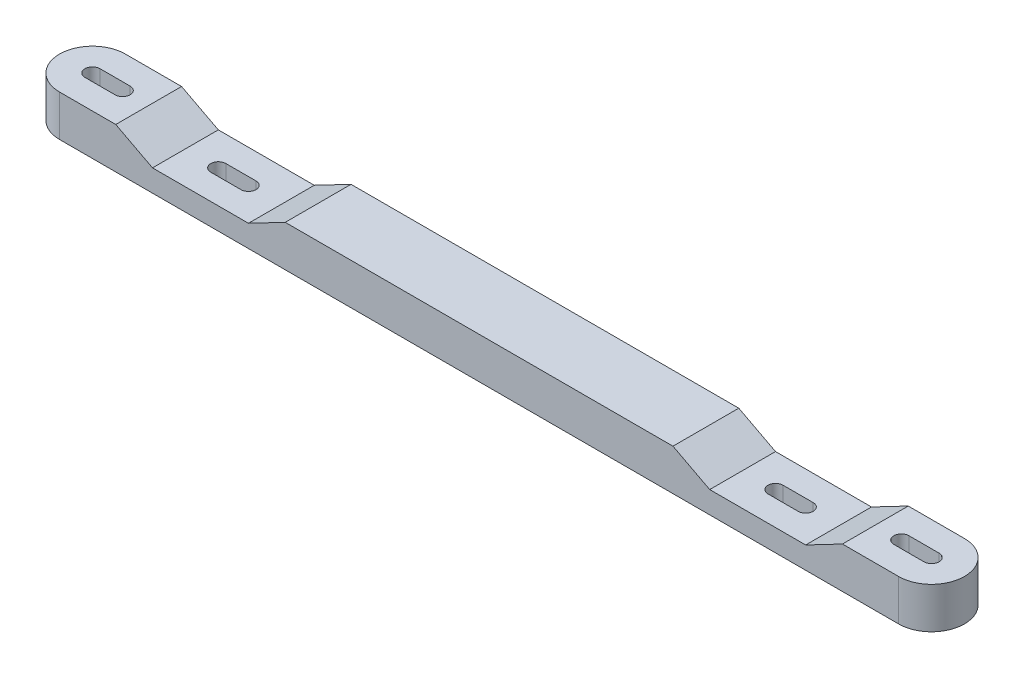
ISO-10303-21;
HEADER;
FILE_DESCRIPTION(('STEP AP214'),'2;1');
FILE_NAME('part.step','',(''),(''),'','','');
FILE_SCHEMA(('AUTOMOTIVE_DESIGN { 1 0 10303 214 1 1 1 1 }'));
ENDSEC;
DATA;
#1=APPLICATION_CONTEXT('core data for automotive mechanical design processes');
#2=APPLICATION_PROTOCOL_DEFINITION('international standard','automotive_design',2000,#1);
#3=PRODUCT_CONTEXT('',#1,'mechanical');
#4=PRODUCT('Part','Part','',(#3));
#5=PRODUCT_RELATED_PRODUCT_CATEGORY('part','',(#4));
#6=PRODUCT_DEFINITION_FORMATION('','',#4);
#7=PRODUCT_DEFINITION_CONTEXT('part definition',#1,'design');
#8=PRODUCT_DEFINITION('design','',#6,#7);
#9=PRODUCT_DEFINITION_SHAPE('','',#8);
#10=(LENGTH_UNIT() NAMED_UNIT(*) SI_UNIT(.MILLI.,.METRE.));
#11=(NAMED_UNIT(*) PLANE_ANGLE_UNIT() SI_UNIT($,.RADIAN.));
#12=(NAMED_UNIT(*) SI_UNIT($,.STERADIAN.) SOLID_ANGLE_UNIT());
#13=UNCERTAINTY_MEASURE_WITH_UNIT(LENGTH_MEASURE(1.E-05),#10,'distance_accuracy_value','');
#14=(GEOMETRIC_REPRESENTATION_CONTEXT(3) GLOBAL_UNCERTAINTY_ASSIGNED_CONTEXT((#13)) GLOBAL_UNIT_ASSIGNED_CONTEXT((#10,
#11,#12)) REPRESENTATION_CONTEXT('',''));
#15=CARTESIAN_POINT('',(0.,0.,0.));
#16=DIRECTION('',(0.,0.,1.));
#17=DIRECTION('',(1.,0.,0.));
#18=AXIS2_PLACEMENT_3D('',#15,#16,#17);
#19=CARTESIAN_POINT('',(-153.,15.,-101.6));
#20=DIRECTION('',(0.,1.,0.));
#21=DIRECTION('',(0.,0.,1.));
#22=AXIS2_PLACEMENT_3D('',#19,#20,#21);
#23=PLANE('',#22);
#24=DIRECTION('',(0.,0.,1.));
#25=VECTOR('',#24,1.);
#26=CARTESIAN_POINT('',(70.6999999999999,15.,-113.6));
#27=LINE('',#26,#25);
#28=CARTESIAN_POINT('',(70.6999999999999,15.,-113.6));
#29=VERTEX_POINT('',#28);
#30=CARTESIAN_POINT('',(70.6999999999999,15.,-89.6));
#31=VERTEX_POINT('',#30);
#32=EDGE_CURVE('E262',#29,#31,#27,.T.);
#33=ORIENTED_EDGE('',*,*,#32,.F.);
#34=DIRECTION('',(-1.,0.,0.));
#35=VECTOR('',#34,1.);
#36=CARTESIAN_POINT('',(-153.,15.,-113.6));
#37=LINE('',#36,#35);
#38=CARTESIAN_POINT('',(-70.7,15.,-113.6));
#39=VERTEX_POINT('',#38);
#40=EDGE_CURVE('E247',#29,#39,#37,.T.);
#41=ORIENTED_EDGE('',*,*,#40,.T.);
#42=DIRECTION('',(0.,0.,1.));
#43=VECTOR('',#42,1.);
#44=CARTESIAN_POINT('',(-70.7,15.,-113.6));
#45=LINE('',#44,#43);
#46=CARTESIAN_POINT('',(-70.7,15.,-89.6));
#47=VERTEX_POINT('',#46);
#48=EDGE_CURVE('E282',#39,#47,#45,.T.);
#49=ORIENTED_EDGE('',*,*,#48,.T.);
#50=DIRECTION('',(1.,0.,0.));
#51=VECTOR('',#50,1.);
#52=CARTESIAN_POINT('',(-153.,15.,-89.6));
#53=LINE('',#52,#51);
#54=EDGE_CURVE('E475',#47,#31,#53,.T.);
#55=ORIENTED_EDGE('',*,*,#54,.T.);
#56=EDGE_LOOP('',(#33,#41,#49,#55));
#57=FACE_BOUND('',#56,.T.);
#58=ADVANCED_FACE('F39',(#57),#23,.T.);
#59=DIRECTION('',(0.,0.,1.));
#60=VECTOR('',#59,1.);
#61=CARTESIAN_POINT('',(132.5,15.,-113.6));
#62=LINE('',#61,#60);
#63=CARTESIAN_POINT('',(132.5,15.,-113.6));
#64=VERTEX_POINT('',#63);
#65=CARTESIAN_POINT('',(132.5,15.,-89.6));
#66=VERTEX_POINT('',#65);
#67=EDGE_CURVE('E266',#64,#66,#62,.T.);
#68=ORIENTED_EDGE('',*,*,#67,.T.);
#69=CARTESIAN_POINT('',(153.,15.,-89.6));
#70=VERTEX_POINT('',#69);
#71=EDGE_CURVE('E468',#66,#70,#53,.T.);
#72=ORIENTED_EDGE('',*,*,#71,.T.);
#73=CARTESIAN_POINT('',(153.,15.,-101.6));
#74=DIRECTION('',(0.,1.,0.));
#75=DIRECTION('',(0.,0.,1.));
#76=AXIS2_PLACEMENT_3D('',#73,#74,#75);
#77=CIRCLE('',#76,12.);
#78=CARTESIAN_POINT('',(153.,15.,-113.6));
#79=VERTEX_POINT('',#78);
#80=EDGE_CURVE('E474',#70,#79,#77,.T.);
#81=ORIENTED_EDGE('',*,*,#80,.T.);
#82=EDGE_CURVE('E479',#79,#64,#37,.T.);
#83=ORIENTED_EDGE('',*,*,#82,.T.);
#84=EDGE_LOOP('',(#68,#72,#81,#83));
#85=FACE_BOUND('',#84,.T.);
#86=DIRECTION('',(-1.,0.,0.));
#87=VECTOR('',#86,1.);
#88=CARTESIAN_POINT('',(153.,15.,-104.35));
#89=LINE('',#88,#87);
#90=CARTESIAN_POINT('',(153.,15.,-104.35));
#91=VERTEX_POINT('',#90);
#92=CARTESIAN_POINT('',(142.,15.,-104.35));
#93=VERTEX_POINT('',#92);
#94=EDGE_CURVE('E325',#91,#93,#89,.T.);
#95=ORIENTED_EDGE('',*,*,#94,.F.);
#96=CARTESIAN_POINT('',(153.,15.,-101.6));
#97=DIRECTION('',(0.,1.,0.));
#98=DIRECTION('',(0.,0.,1.));
#99=AXIS2_PLACEMENT_3D('',#96,#97,#98);
#100=CIRCLE('',#99,2.75);
#101=CARTESIAN_POINT('',(153.,15.,-98.85));
#102=VERTEX_POINT('',#101);
#103=EDGE_CURVE('E322',#102,#91,#100,.T.);
#104=ORIENTED_EDGE('',*,*,#103,.F.);
#105=DIRECTION('',(1.,0.,0.));
#106=VECTOR('',#105,1.);
#107=CARTESIAN_POINT('',(153.,15.,-98.85));
#108=LINE('',#107,#106);
#109=CARTESIAN_POINT('',(142.,15.,-98.85));
#110=VERTEX_POINT('',#109);
#111=EDGE_CURVE('E333',#110,#102,#108,.T.);
#112=ORIENTED_EDGE('',*,*,#111,.F.);
#113=CARTESIAN_POINT('',(142.,15.,-101.6));
#114=DIRECTION('',(0.,1.,0.));
#115=DIRECTION('',(0.,0.,1.));
#116=AXIS2_PLACEMENT_3D('',#113,#114,#115);
#117=CIRCLE('',#116,2.75);
#118=EDGE_CURVE('E329',#93,#110,#117,.T.);
#119=ORIENTED_EDGE('',*,*,#118,.F.);
#120=EDGE_LOOP('',(#95,#104,#112,#119));
#121=FACE_BOUND('',#120,.T.);
#122=ADVANCED_FACE('F546',(#85,#121),#23,.T.);
#123=DIRECTION('',(0.,0.,1.));
#124=VECTOR('',#123,1.);
#125=CARTESIAN_POINT('',(-132.5,15.,-113.6));
#126=LINE('',#125,#124);
#127=CARTESIAN_POINT('',(-132.5,15.,-113.6));
#128=VERTEX_POINT('',#127);
#129=CARTESIAN_POINT('',(-132.5,15.,-89.6));
#130=VERTEX_POINT('',#129);
#131=EDGE_CURVE('E298',#128,#130,#126,.T.);
#132=ORIENTED_EDGE('',*,*,#131,.F.);
#133=CARTESIAN_POINT('',(-153.,15.,-113.6));
#134=VERTEX_POINT('',#133);
#135=EDGE_CURVE('E478',#128,#134,#37,.T.);
#136=ORIENTED_EDGE('',*,*,#135,.T.);
#137=CARTESIAN_POINT('',(-153.,15.,-101.6));
#138=DIRECTION('',(0.,1.,0.));
#139=DIRECTION('',(0.,0.,1.));
#140=AXIS2_PLACEMENT_3D('',#137,#138,#139);
#141=CIRCLE('',#140,12.);
#142=CARTESIAN_POINT('',(-153.,15.,-89.6));
#143=VERTEX_POINT('',#142);
#144=EDGE_CURVE('E464',#134,#143,#141,.T.);
#145=ORIENTED_EDGE('',*,*,#144,.T.);
#146=EDGE_CURVE('E470',#143,#130,#53,.T.);
#147=ORIENTED_EDGE('',*,*,#146,.T.);
#148=EDGE_LOOP('',(#132,#136,#145,#147));
#149=FACE_BOUND('',#148,.T.);
#150=DIRECTION('',(1.,0.,0.));
#151=VECTOR('',#150,1.);
#152=CARTESIAN_POINT('',(-153.,15.,-98.85));
#153=LINE('',#152,#151);
#154=CARTESIAN_POINT('',(-153.,15.,-98.85));
#155=VERTEX_POINT('',#154);
#156=CARTESIAN_POINT('',(-142.,15.,-98.85));
#157=VERTEX_POINT('',#156);
#158=EDGE_CURVE('E424',#155,#157,#153,.T.);
#159=ORIENTED_EDGE('',*,*,#158,.F.);
#160=CARTESIAN_POINT('',(-153.,15.,-101.6));
#161=DIRECTION('',(0.,1.,0.));
#162=DIRECTION('',(0.,0.,1.));
#163=AXIS2_PLACEMENT_3D('',#160,#161,#162);
#164=CIRCLE('',#163,2.75);
#165=CARTESIAN_POINT('',(-153.,15.,-104.35));
#166=VERTEX_POINT('',#165);
#167=EDGE_CURVE('E421',#166,#155,#164,.T.);
#168=ORIENTED_EDGE('',*,*,#167,.F.);
#169=DIRECTION('',(-1.,0.,0.));
#170=VECTOR('',#169,1.);
#171=CARTESIAN_POINT('',(-153.,15.,-104.35));
#172=LINE('',#171,#170);
#173=CARTESIAN_POINT('',(-142.,15.,-104.35));
#174=VERTEX_POINT('',#173);
#175=EDGE_CURVE('E432',#174,#166,#172,.T.);
#176=ORIENTED_EDGE('',*,*,#175,.F.);
#177=CARTESIAN_POINT('',(-142.,15.,-101.6));
#178=DIRECTION('',(0.,1.,0.));
#179=DIRECTION('',(0.,0.,1.));
#180=AXIS2_PLACEMENT_3D('',#177,#178,#179);
#181=CIRCLE('',#180,2.75);
#182=EDGE_CURVE('E428',#157,#174,#181,.T.);
#183=ORIENTED_EDGE('',*,*,#182,.F.);
#184=EDGE_LOOP('',(#159,#168,#176,#183));
#185=FACE_BOUND('',#184,.T.);
#186=ADVANCED_FACE('F549',(#149,#185),#23,.T.);
#187=CARTESIAN_POINT('',(-153.,0.,-101.6));
#188=DIRECTION('',(0.,1.,0.));
#189=DIRECTION('',(0.,0.,1.));
#190=AXIS2_PLACEMENT_3D('',#187,#188,#189);
#191=PLANE('',#190);
#192=CARTESIAN_POINT('',(96.1,0.,-101.6));
#193=DIRECTION('',(0.,1.,0.));
#194=DIRECTION('',(0.,0.,1.));
#195=AXIS2_PLACEMENT_3D('',#192,#193,#194);
#196=CIRCLE('',#195,2.75);
#197=CARTESIAN_POINT('',(96.1,0.,-104.35));
#198=VERTEX_POINT('',#197);
#199=CARTESIAN_POINT('',(96.1,0.,-98.85));
#200=VERTEX_POINT('',#199);
#201=EDGE_CURVE('E364',#198,#200,#196,.T.);
#202=ORIENTED_EDGE('',*,*,#201,.T.);
#203=DIRECTION('',(1.,0.,0.));
#204=VECTOR('',#203,1.);
#205=CARTESIAN_POINT('',(96.1,0.,-98.85));
#206=LINE('',#205,#204);
#207=CARTESIAN_POINT('',(107.1,0.,-98.85));
#208=VERTEX_POINT('',#207);
#209=EDGE_CURVE('E368',#200,#208,#206,.T.);
#210=ORIENTED_EDGE('',*,*,#209,.T.);
#211=CARTESIAN_POINT('',(107.1,0.,-101.6));
#212=DIRECTION('',(0.,1.,0.));
#213=DIRECTION('',(0.,0.,1.));
#214=AXIS2_PLACEMENT_3D('',#211,#212,#213);
#215=CIRCLE('',#214,2.75);
#216=CARTESIAN_POINT('',(107.1,0.,-104.35));
#217=VERTEX_POINT('',#216);
#218=EDGE_CURVE('E372',#208,#217,#215,.T.);
#219=ORIENTED_EDGE('',*,*,#218,.T.);
#220=DIRECTION('',(-1.,0.,0.));
#221=VECTOR('',#220,1.);
#222=CARTESIAN_POINT('',(96.1,0.,-104.35));
#223=LINE('',#222,#221);
#224=EDGE_CURVE('E376',#217,#198,#223,.T.);
#225=ORIENTED_EDGE('',*,*,#224,.T.);
#226=EDGE_LOOP('',(#202,#210,#219,#225));
#227=FACE_BOUND('',#226,.T.);
#228=CARTESIAN_POINT('',(-153.,0.,-101.6));
#229=DIRECTION('',(0.,1.,0.));
#230=DIRECTION('',(0.,0.,1.));
#231=AXIS2_PLACEMENT_3D('',#228,#229,#230);
#232=CIRCLE('',#231,2.75);
#233=CARTESIAN_POINT('',(-153.,0.,-104.35));
#234=VERTEX_POINT('',#233);
#235=CARTESIAN_POINT('',(-153.,0.,-98.85));
#236=VERTEX_POINT('',#235);
#237=EDGE_CURVE('E420',#234,#236,#232,.T.);
#238=ORIENTED_EDGE('',*,*,#237,.T.);
#239=DIRECTION('',(1.,0.,0.));
#240=VECTOR('',#239,1.);
#241=CARTESIAN_POINT('',(-153.,0.,-98.85));
#242=LINE('',#241,#240);
#243=CARTESIAN_POINT('',(-142.,0.,-98.85));
#244=VERTEX_POINT('',#243);
#245=EDGE_CURVE('E439',#236,#244,#242,.T.);
#246=ORIENTED_EDGE('',*,*,#245,.T.);
#247=CARTESIAN_POINT('',(-142.,0.,-101.6));
#248=DIRECTION('',(0.,1.,0.));
#249=DIRECTION('',(0.,0.,1.));
#250=AXIS2_PLACEMENT_3D('',#247,#248,#249);
#251=CIRCLE('',#250,2.75);
#252=CARTESIAN_POINT('',(-142.,0.,-104.35));
#253=VERTEX_POINT('',#252);
#254=EDGE_CURVE('E443',#244,#253,#251,.T.);
#255=ORIENTED_EDGE('',*,*,#254,.T.);
#256=DIRECTION('',(-1.,0.,0.));
#257=VECTOR('',#256,1.);
#258=CARTESIAN_POINT('',(-153.,0.,-104.35));
#259=LINE('',#258,#257);
#260=EDGE_CURVE('E425',#253,#234,#259,.T.);
#261=ORIENTED_EDGE('',*,*,#260,.T.);
#262=EDGE_LOOP('',(#238,#246,#255,#261));
#263=FACE_BOUND('',#262,.T.);
#264=CARTESIAN_POINT('',(-153.,0.,-101.6));
#265=DIRECTION('',(0.,1.,0.));
#266=DIRECTION('',(0.,0.,1.));
#267=AXIS2_PLACEMENT_3D('',#264,#265,#266);
#268=CIRCLE('',#267,12.);
#269=CARTESIAN_POINT('',(-153.,0.,-113.6));
#270=VERTEX_POINT('',#269);
#271=CARTESIAN_POINT('',(-153.,0.,-89.6));
#272=VERTEX_POINT('',#271);
#273=EDGE_CURVE('E463',#270,#272,#268,.T.);
#274=ORIENTED_EDGE('',*,*,#273,.F.);
#275=DIRECTION('',(-1.,0.,0.));
#276=VECTOR('',#275,1.);
#277=CARTESIAN_POINT('',(-153.,0.,-113.6));
#278=LINE('',#277,#276);
#279=CARTESIAN_POINT('',(153.,0.,-113.6));
#280=VERTEX_POINT('',#279);
#281=EDGE_CURVE('E469',#280,#270,#278,.T.);
#282=ORIENTED_EDGE('',*,*,#281,.F.);
#283=CARTESIAN_POINT('',(153.,0.,-101.6));
#284=DIRECTION('',(0.,1.,0.));
#285=DIRECTION('',(0.,0.,1.));
#286=AXIS2_PLACEMENT_3D('',#283,#284,#285);
#287=CIRCLE('',#286,12.);
#288=CARTESIAN_POINT('',(153.,0.,-89.6));
#289=VERTEX_POINT('',#288);
#290=EDGE_CURVE('E490',#289,#280,#287,.T.);
#291=ORIENTED_EDGE('',*,*,#290,.F.);
#292=DIRECTION('',(1.,0.,0.));
#293=VECTOR('',#292,1.);
#294=CARTESIAN_POINT('',(-153.,0.,-89.6));
#295=LINE('',#294,#293);
#296=EDGE_CURVE('E487',#272,#289,#295,.T.);
#297=ORIENTED_EDGE('',*,*,#296,.F.);
#298=EDGE_LOOP('',(#274,#282,#291,#297));
#299=FACE_BOUND('',#298,.T.);
#300=CARTESIAN_POINT('',(-107.1,0.,-101.6));
#301=DIRECTION('',(0.,1.,0.));
#302=DIRECTION('',(0.,0.,1.));
#303=AXIS2_PLACEMENT_3D('',#300,#301,#302);
#304=CIRCLE('',#303,2.75);
#305=CARTESIAN_POINT('',(-107.1,0.,-104.35));
#306=VERTEX_POINT('',#305);
#307=CARTESIAN_POINT('',(-107.1,0.,-98.85));
#308=VERTEX_POINT('',#307);
#309=EDGE_CURVE('E392',#306,#308,#304,.T.);
#310=ORIENTED_EDGE('',*,*,#309,.T.);
#311=DIRECTION('',(1.,0.,0.));
#312=VECTOR('',#311,1.);
#313=CARTESIAN_POINT('',(-107.1,0.,-98.85));
#314=LINE('',#313,#312);
#315=CARTESIAN_POINT('',(-96.1,0.,-98.85));
#316=VERTEX_POINT('',#315);
#317=EDGE_CURVE('E396',#308,#316,#314,.T.);
#318=ORIENTED_EDGE('',*,*,#317,.T.);
#319=CARTESIAN_POINT('',(-96.1,0.,-101.6));
#320=DIRECTION('',(0.,1.,0.));
#321=DIRECTION('',(0.,0.,1.));
#322=AXIS2_PLACEMENT_3D('',#319,#320,#321);
#323=CIRCLE('',#322,2.75);
#324=CARTESIAN_POINT('',(-96.1,0.,-104.35));
#325=VERTEX_POINT('',#324);
#326=EDGE_CURVE('E400',#316,#325,#323,.T.);
#327=ORIENTED_EDGE('',*,*,#326,.T.);
#328=DIRECTION('',(-1.,0.,0.));
#329=VECTOR('',#328,1.);
#330=CARTESIAN_POINT('',(-107.1,0.,-104.35));
#331=LINE('',#330,#329);
#332=EDGE_CURVE('E404',#325,#306,#331,.T.);
#333=ORIENTED_EDGE('',*,*,#332,.T.);
#334=EDGE_LOOP('',(#310,#318,#327,#333));
#335=FACE_BOUND('',#334,.T.);
#336=CARTESIAN_POINT('',(153.,0.,-101.6));
#337=DIRECTION('',(0.,1.,0.));
#338=DIRECTION('',(0.,0.,1.));
#339=AXIS2_PLACEMENT_3D('',#336,#337,#338);
#340=CIRCLE('',#339,2.75);
#341=CARTESIAN_POINT('',(153.,0.,-98.85));
#342=VERTEX_POINT('',#341);
#343=CARTESIAN_POINT('',(153.,0.,-104.35));
#344=VERTEX_POINT('',#343);
#345=EDGE_CURVE('E321',#342,#344,#340,.T.);
#346=ORIENTED_EDGE('',*,*,#345,.T.);
#347=DIRECTION('',(-1.,0.,0.));
#348=VECTOR('',#347,1.);
#349=CARTESIAN_POINT('',(153.,0.,-104.35));
#350=LINE('',#349,#348);
#351=CARTESIAN_POINT('',(142.,0.,-104.35));
#352=VERTEX_POINT('',#351);
#353=EDGE_CURVE('E340',#344,#352,#350,.T.);
#354=ORIENTED_EDGE('',*,*,#353,.T.);
#355=CARTESIAN_POINT('',(142.,0.,-101.6));
#356=DIRECTION('',(0.,1.,0.));
#357=DIRECTION('',(0.,0.,1.));
#358=AXIS2_PLACEMENT_3D('',#355,#356,#357);
#359=CIRCLE('',#358,2.75);
#360=CARTESIAN_POINT('',(142.,0.,-98.85));
#361=VERTEX_POINT('',#360);
#362=EDGE_CURVE('E344',#352,#361,#359,.T.);
#363=ORIENTED_EDGE('',*,*,#362,.T.);
#364=DIRECTION('',(1.,0.,0.));
#365=VECTOR('',#364,1.);
#366=CARTESIAN_POINT('',(153.,0.,-98.85));
#367=LINE('',#366,#365);
#368=EDGE_CURVE('E326',#361,#342,#367,.T.);
#369=ORIENTED_EDGE('',*,*,#368,.T.);
#370=EDGE_LOOP('',(#346,#354,#363,#369));
#371=FACE_BOUND('',#370,.T.);
#372=ADVANCED_FACE('F526',(#227,#263,#299,#335,#371),#191,.F.);
#373=CARTESIAN_POINT('',(-153.,15.,-101.6));
#374=DIRECTION('',(0.,-1.,0.));
#375=DIRECTION('',(0.,0.,-1.));
#376=AXIS2_PLACEMENT_3D('',#373,#374,#375);
#377=CYLINDRICAL_SURFACE('',#376,12.);
#378=ORIENTED_EDGE('',*,*,#273,.T.);
#379=DIRECTION('',(0.,-1.,0.));
#380=VECTOR('',#379,1.);
#381=CARTESIAN_POINT('',(-153.,15.,-89.6));
#382=LINE('',#381,#380);
#383=EDGE_CURVE('E506',#143,#272,#382,.T.);
#384=ORIENTED_EDGE('',*,*,#383,.F.);
#385=ORIENTED_EDGE('',*,*,#144,.F.);
#386=DIRECTION('',(0.,-1.,0.));
#387=VECTOR('',#386,1.);
#388=CARTESIAN_POINT('',(-153.,15.,-113.6));
#389=LINE('',#388,#387);
#390=EDGE_CURVE('E483',#134,#270,#389,.T.);
#391=ORIENTED_EDGE('',*,*,#390,.T.);
#392=EDGE_LOOP('',(#378,#384,#385,#391));
#393=FACE_BOUND('',#392,.T.);
#394=ADVANCED_FACE('F41',(#393),#377,.T.);
#395=CARTESIAN_POINT('',(-153.,15.,-89.6));
#396=DIRECTION('',(0.,0.,-1.));
#397=DIRECTION('',(-1.,0.,0.));
#398=AXIS2_PLACEMENT_3D('',#395,#396,#397);
#399=PLANE('',#398);
#400=DIRECTION('',(1.,0.,0.));
#401=VECTOR('',#400,1.);
#402=CARTESIAN_POINT('',(84.1,8.,-89.6));
#403=LINE('',#402,#401);
#404=CARTESIAN_POINT('',(84.1,8.,-89.6));
#405=VERTEX_POINT('',#404);
#406=CARTESIAN_POINT('',(119.1,8.,-89.6));
#407=VERTEX_POINT('',#406);
#408=EDGE_CURVE('E252',#405,#407,#403,.T.);
#409=ORIENTED_EDGE('',*,*,#408,.F.);
#410=DIRECTION('',(0.886348848204835,-0.463018055032374,0.));
#411=VECTOR('',#410,1.);
#412=CARTESIAN_POINT('',(70.6999999999999,15.,-89.6));
#413=LINE('',#412,#411);
#414=EDGE_CURVE('E230',#31,#405,#413,.T.);
#415=ORIENTED_EDGE('',*,*,#414,.F.);
#416=ORIENTED_EDGE('',*,*,#54,.F.);
#417=DIRECTION('',(0.886348848204835,0.463018055032374,0.));
#418=VECTOR('',#417,1.);
#419=CARTESIAN_POINT('',(-84.1,8.,-89.6));
#420=LINE('',#419,#418);
#421=CARTESIAN_POINT('',(-84.1,8.,-89.6));
#422=VERTEX_POINT('',#421);
#423=EDGE_CURVE('E283',#422,#47,#420,.T.);
#424=ORIENTED_EDGE('',*,*,#423,.F.);
#425=DIRECTION('',(1.,0.,0.));
#426=VECTOR('',#425,1.);
#427=CARTESIAN_POINT('',(-119.1,8.,-89.6));
#428=LINE('',#427,#426);
#429=CARTESIAN_POINT('',(-119.1,8.,-89.6));
#430=VERTEX_POINT('',#429);
#431=EDGE_CURVE('E276',#430,#422,#428,.T.);
#432=ORIENTED_EDGE('',*,*,#431,.F.);
#433=DIRECTION('',(0.886348848204835,-0.463018055032374,0.));
#434=VECTOR('',#433,1.);
#435=CARTESIAN_POINT('',(-132.5,15.,-89.6));
#436=LINE('',#435,#434);
#437=EDGE_CURVE('E286',#130,#430,#436,.T.);
#438=ORIENTED_EDGE('',*,*,#437,.F.);
#439=ORIENTED_EDGE('',*,*,#146,.F.);
#440=ORIENTED_EDGE('',*,*,#383,.T.);
#441=ORIENTED_EDGE('',*,*,#296,.T.);
#442=DIRECTION('',(0.,-1.,0.));
#443=VECTOR('',#442,1.);
#444=CARTESIAN_POINT('',(153.,15.,-89.6));
#445=LINE('',#444,#443);
#446=EDGE_CURVE('E502',#70,#289,#445,.T.);
#447=ORIENTED_EDGE('',*,*,#446,.F.);
#448=ORIENTED_EDGE('',*,*,#71,.F.);
#449=DIRECTION('',(0.886348848204835,0.463018055032374,0.));
#450=VECTOR('',#449,1.);
#451=CARTESIAN_POINT('',(119.1,8.,-89.6));
#452=LINE('',#451,#450);
#453=EDGE_CURVE('E249',#407,#66,#452,.T.);
#454=ORIENTED_EDGE('',*,*,#453,.F.);
#455=EDGE_LOOP('',(#409,#415,#416,#424,#432,#438,#439,#440,#441,#447,#448,#454));
#456=FACE_BOUND('',#455,.T.);
#457=ADVANCED_FACE('F605',(#456),#399,.F.);
#458=CARTESIAN_POINT('',(153.,15.,-101.6));
#459=DIRECTION('',(0.,-1.,0.));
#460=DIRECTION('',(0.,0.,-1.));
#461=AXIS2_PLACEMENT_3D('',#458,#459,#460);
#462=CYLINDRICAL_SURFACE('',#461,12.);
#463=ORIENTED_EDGE('',*,*,#290,.T.);
#464=DIRECTION('',(0.,-1.,0.));
#465=VECTOR('',#464,1.);
#466=CARTESIAN_POINT('',(153.,15.,-113.6));
#467=LINE('',#466,#465);
#468=EDGE_CURVE('E498',#79,#280,#467,.T.);
#469=ORIENTED_EDGE('',*,*,#468,.F.);
#470=ORIENTED_EDGE('',*,*,#80,.F.);
#471=ORIENTED_EDGE('',*,*,#446,.T.);
#472=EDGE_LOOP('',(#463,#469,#470,#471));
#473=FACE_BOUND('',#472,.T.);
#474=ADVANCED_FACE('F600',(#473),#462,.T.);
#475=CARTESIAN_POINT('',(-153.,15.,-113.6));
#476=DIRECTION('',(0.,0.,1.));
#477=DIRECTION('',(1.,0.,0.));
#478=AXIS2_PLACEMENT_3D('',#475,#476,#477);
#479=PLANE('',#478);
#480=ORIENTED_EDGE('',*,*,#40,.F.);
#481=DIRECTION('',(0.886348848204835,-0.463018055032374,0.));
#482=VECTOR('',#481,1.);
#483=CARTESIAN_POINT('',(70.6999999999999,15.,-113.6));
#484=LINE('',#483,#482);
#485=CARTESIAN_POINT('',(84.1,8.,-113.6));
#486=VERTEX_POINT('',#485);
#487=EDGE_CURVE('E227',#29,#486,#484,.T.);
#488=ORIENTED_EDGE('',*,*,#487,.T.);
#489=DIRECTION('',(1.,0.,0.));
#490=VECTOR('',#489,1.);
#491=CARTESIAN_POINT('',(84.1,8.,-113.6));
#492=LINE('',#491,#490);
#493=CARTESIAN_POINT('',(119.1,8.,-113.6));
#494=VERTEX_POINT('',#493);
#495=EDGE_CURVE('E238',#486,#494,#492,.T.);
#496=ORIENTED_EDGE('',*,*,#495,.T.);
#497=DIRECTION('',(0.886348848204835,0.463018055032374,0.));
#498=VECTOR('',#497,1.);
#499=CARTESIAN_POINT('',(119.1,8.,-113.6));
#500=LINE('',#499,#498);
#501=EDGE_CURVE('E55',#494,#64,#500,.T.);
#502=ORIENTED_EDGE('',*,*,#501,.T.);
#503=ORIENTED_EDGE('',*,*,#82,.F.);
#504=ORIENTED_EDGE('',*,*,#468,.T.);
#505=ORIENTED_EDGE('',*,*,#281,.T.);
#506=ORIENTED_EDGE('',*,*,#390,.F.);
#507=ORIENTED_EDGE('',*,*,#135,.F.);
#508=DIRECTION('',(0.886348848204835,-0.463018055032374,0.));
#509=VECTOR('',#508,1.);
#510=CARTESIAN_POINT('',(-132.5,15.,-113.6));
#511=LINE('',#510,#509);
#512=CARTESIAN_POINT('',(-119.1,8.00000000000001,-113.6));
#513=VERTEX_POINT('',#512);
#514=EDGE_CURVE('E275',#128,#513,#511,.T.);
#515=ORIENTED_EDGE('',*,*,#514,.T.);
#516=DIRECTION('',(1.,0.,0.));
#517=VECTOR('',#516,1.);
#518=CARTESIAN_POINT('',(-119.1,8.,-113.6));
#519=LINE('',#518,#517);
#520=CARTESIAN_POINT('',(-84.1,8.,-113.6));
#521=VERTEX_POINT('',#520);
#522=EDGE_CURVE('E63',#513,#521,#519,.T.);
#523=ORIENTED_EDGE('',*,*,#522,.T.);
#524=DIRECTION('',(0.886348848204835,0.463018055032374,0.));
#525=VECTOR('',#524,1.);
#526=CARTESIAN_POINT('',(-84.1,8.,-113.6));
#527=LINE('',#526,#525);
#528=EDGE_CURVE('E272',#521,#39,#527,.T.);
#529=ORIENTED_EDGE('',*,*,#528,.T.);
#530=EDGE_LOOP('',(#480,#488,#496,#502,#503,#504,#505,#506,#507,#515,#523,#529));
#531=FACE_BOUND('',#530,.T.);
#532=ADVANCED_FACE('F244',(#531),#479,.F.);
#533=CARTESIAN_POINT('',(-153.,15.,-101.6));
#534=DIRECTION('',(0.,-1.,0.));
#535=DIRECTION('',(0.,0.,-1.));
#536=AXIS2_PLACEMENT_3D('',#533,#534,#535);
#537=CYLINDRICAL_SURFACE('',#536,2.75);
#538=ORIENTED_EDGE('',*,*,#237,.F.);
#539=DIRECTION('',(0.,-1.,0.));
#540=VECTOR('',#539,1.);
#541=CARTESIAN_POINT('',(-153.,15.,-104.35));
#542=LINE('',#541,#540);
#543=EDGE_CURVE('E435',#166,#234,#542,.T.);
#544=ORIENTED_EDGE('',*,*,#543,.F.);
#545=ORIENTED_EDGE('',*,*,#167,.T.);
#546=DIRECTION('',(0.,-1.,0.));
#547=VECTOR('',#546,1.);
#548=CARTESIAN_POINT('',(-153.,15.,-98.85));
#549=LINE('',#548,#547);
#550=EDGE_CURVE('E459',#155,#236,#549,.T.);
#551=ORIENTED_EDGE('',*,*,#550,.T.);
#552=EDGE_LOOP('',(#538,#544,#545,#551));
#553=FACE_BOUND('',#552,.T.);
#554=ADVANCED_FACE('F578',(#553),#537,.F.);
#555=CARTESIAN_POINT('',(-153.,15.,-98.85));
#556=DIRECTION('',(0.,0.,-1.));
#557=DIRECTION('',(-1.,0.,0.));
#558=AXIS2_PLACEMENT_3D('',#555,#556,#557);
#559=PLANE('',#558);
#560=ORIENTED_EDGE('',*,*,#245,.F.);
#561=ORIENTED_EDGE('',*,*,#550,.F.);
#562=ORIENTED_EDGE('',*,*,#158,.T.);
#563=DIRECTION('',(0.,-1.,0.));
#564=VECTOR('',#563,1.);
#565=CARTESIAN_POINT('',(-142.,15.,-98.85));
#566=LINE('',#565,#564);
#567=EDGE_CURVE('E456',#157,#244,#566,.T.);
#568=ORIENTED_EDGE('',*,*,#567,.T.);
#569=EDGE_LOOP('',(#560,#561,#562,#568));
#570=FACE_BOUND('',#569,.T.);
#571=ADVANCED_FACE('F571',(#570),#559,.T.);
#572=CARTESIAN_POINT('',(-142.,15.,-101.6));
#573=DIRECTION('',(0.,-1.,0.));
#574=DIRECTION('',(0.,0.,-1.));
#575=AXIS2_PLACEMENT_3D('',#572,#573,#574);
#576=CYLINDRICAL_SURFACE('',#575,2.75);
#577=ORIENTED_EDGE('',*,*,#254,.F.);
#578=ORIENTED_EDGE('',*,*,#567,.F.);
#579=ORIENTED_EDGE('',*,*,#182,.T.);
#580=DIRECTION('',(0.,-1.,0.));
#581=VECTOR('',#580,1.);
#582=CARTESIAN_POINT('',(-142.,15.,-104.35));
#583=LINE('',#582,#581);
#584=EDGE_CURVE('E453',#174,#253,#583,.T.);
#585=ORIENTED_EDGE('',*,*,#584,.T.);
#586=EDGE_LOOP('',(#577,#578,#579,#585));
#587=FACE_BOUND('',#586,.T.);
#588=ADVANCED_FACE('F574',(#587),#576,.F.);
#589=CARTESIAN_POINT('',(-153.,15.,-104.35));
#590=DIRECTION('',(0.,0.,1.));
#591=DIRECTION('',(1.,0.,0.));
#592=AXIS2_PLACEMENT_3D('',#589,#590,#591);
#593=PLANE('',#592);
#594=ORIENTED_EDGE('',*,*,#260,.F.);
#595=ORIENTED_EDGE('',*,*,#584,.F.);
#596=ORIENTED_EDGE('',*,*,#175,.T.);
#597=ORIENTED_EDGE('',*,*,#543,.T.);
#598=EDGE_LOOP('',(#594,#595,#596,#597));
#599=FACE_BOUND('',#598,.T.);
#600=ADVANCED_FACE('F581',(#599),#593,.T.);
#601=CARTESIAN_POINT('',(-107.1,15.,-101.6));
#602=DIRECTION('',(0.,-1.,0.));
#603=DIRECTION('',(0.,0.,-1.));
#604=AXIS2_PLACEMENT_3D('',#601,#602,#603);
#605=CYLINDRICAL_SURFACE('',#604,2.75);
#606=CARTESIAN_POINT('',(-107.1,8.,-101.6));
#607=DIRECTION('',(0.,-1.,0.));
#608=DIRECTION('',(1.,0.,0.));
#609=AXIS2_PLACEMENT_3D('',#606,#607,#608);
#610=CIRCLE('',#609,2.75);
#611=CARTESIAN_POINT('',(-107.1,8.,-98.85));
#612=VERTEX_POINT('',#611);
#613=CARTESIAN_POINT('',(-107.1,8.,-104.35));
#614=VERTEX_POINT('',#613);
#615=EDGE_CURVE('E318',#612,#614,#610,.T.);
#616=ORIENTED_EDGE('',*,*,#615,.F.);
#617=DIRECTION('',(0.,-1.,0.));
#618=VECTOR('',#617,1.);
#619=CARTESIAN_POINT('',(-107.1,15.,-98.85));
#620=LINE('',#619,#618);
#621=EDGE_CURVE('E417',#612,#308,#620,.T.);
#622=ORIENTED_EDGE('',*,*,#621,.T.);
#623=ORIENTED_EDGE('',*,*,#309,.F.);
#624=DIRECTION('',(0.,-1.,0.));
#625=VECTOR('',#624,1.);
#626=CARTESIAN_POINT('',(-107.1,15.,-104.35));
#627=LINE('',#626,#625);
#628=EDGE_CURVE('E408',#614,#306,#627,.T.);
#629=ORIENTED_EDGE('',*,*,#628,.F.);
#630=EDGE_LOOP('',(#616,#622,#623,#629));
#631=FACE_BOUND('',#630,.T.);
#632=ADVANCED_FACE('F583',(#631),#605,.F.);
#633=CARTESIAN_POINT('',(-107.1,15.,-98.85));
#634=DIRECTION('',(0.,0.,-1.));
#635=DIRECTION('',(-1.,0.,0.));
#636=AXIS2_PLACEMENT_3D('',#633,#634,#635);
#637=PLANE('',#636);
#638=DIRECTION('',(-1.,0.,0.));
#639=VECTOR('',#638,1.);
#640=CARTESIAN_POINT('',(-107.1,8.,-98.85));
#641=LINE('',#640,#639);
#642=CARTESIAN_POINT('',(-96.1,8.,-98.85));
#643=VERTEX_POINT('',#642);
#644=EDGE_CURVE('E315',#643,#612,#641,.T.);
#645=ORIENTED_EDGE('',*,*,#644,.F.);
#646=DIRECTION('',(0.,-1.,0.));
#647=VECTOR('',#646,1.);
#648=CARTESIAN_POINT('',(-96.1,15.,-98.85));
#649=LINE('',#648,#647);
#650=EDGE_CURVE('E414',#643,#316,#649,.T.);
#651=ORIENTED_EDGE('',*,*,#650,.T.);
#652=ORIENTED_EDGE('',*,*,#317,.F.);
#653=ORIENTED_EDGE('',*,*,#621,.F.);
#654=EDGE_LOOP('',(#645,#651,#652,#653));
#655=FACE_BOUND('',#654,.T.);
#656=ADVANCED_FACE('F589',(#655),#637,.T.);
#657=CARTESIAN_POINT('',(-96.1,15.,-101.6));
#658=DIRECTION('',(0.,-1.,0.));
#659=DIRECTION('',(0.,0.,-1.));
#660=AXIS2_PLACEMENT_3D('',#657,#658,#659);
#661=CYLINDRICAL_SURFACE('',#660,2.75);
#662=CARTESIAN_POINT('',(-96.1,8.,-101.6));
#663=DIRECTION('',(0.,-1.,0.));
#664=DIRECTION('',(1.,0.,0.));
#665=AXIS2_PLACEMENT_3D('',#662,#663,#664);
#666=CIRCLE('',#665,2.75);
#667=CARTESIAN_POINT('',(-96.1,8.,-104.35));
#668=VERTEX_POINT('',#667);
#669=EDGE_CURVE('E312',#668,#643,#666,.T.);
#670=ORIENTED_EDGE('',*,*,#669,.F.);
#671=DIRECTION('',(0.,-1.,0.));
#672=VECTOR('',#671,1.);
#673=CARTESIAN_POINT('',(-96.1,15.,-104.35));
#674=LINE('',#673,#672);
#675=EDGE_CURVE('E411',#668,#325,#674,.T.);
#676=ORIENTED_EDGE('',*,*,#675,.T.);
#677=ORIENTED_EDGE('',*,*,#326,.F.);
#678=ORIENTED_EDGE('',*,*,#650,.F.);
#679=EDGE_LOOP('',(#670,#676,#677,#678));
#680=FACE_BOUND('',#679,.T.);
#681=ADVANCED_FACE('F542',(#680),#661,.F.);
#682=CARTESIAN_POINT('',(-107.1,15.,-104.35));
#683=DIRECTION('',(0.,0.,1.));
#684=DIRECTION('',(1.,0.,0.));
#685=AXIS2_PLACEMENT_3D('',#682,#683,#684);
#686=PLANE('',#685);
#687=DIRECTION('',(1.,0.,0.));
#688=VECTOR('',#687,1.);
#689=CARTESIAN_POINT('',(-107.1,8.,-104.35));
#690=LINE('',#689,#688);
#691=EDGE_CURVE('E11',#614,#668,#690,.T.);
#692=ORIENTED_EDGE('',*,*,#691,.F.);
#693=ORIENTED_EDGE('',*,*,#628,.T.);
#694=ORIENTED_EDGE('',*,*,#332,.F.);
#695=ORIENTED_EDGE('',*,*,#675,.F.);
#696=EDGE_LOOP('',(#692,#693,#694,#695));
#697=FACE_BOUND('',#696,.T.);
#698=ADVANCED_FACE('F535',(#697),#686,.T.);
#699=CARTESIAN_POINT('',(96.1,15.,-101.6));
#700=DIRECTION('',(0.,-1.,0.));
#701=DIRECTION('',(0.,0.,-1.));
#702=AXIS2_PLACEMENT_3D('',#699,#700,#701);
#703=CYLINDRICAL_SURFACE('',#702,2.75);
#704=CARTESIAN_POINT('',(96.1,8.,-101.6));
#705=DIRECTION('',(0.,-1.,0.));
#706=DIRECTION('',(0.,0.,-1.));
#707=AXIS2_PLACEMENT_3D('',#704,#705,#706);
#708=CIRCLE('',#707,2.75);
#709=CARTESIAN_POINT('',(96.1,8.,-98.85));
#710=VERTEX_POINT('',#709);
#711=CARTESIAN_POINT('',(96.1,8.,-104.35));
#712=VERTEX_POINT('',#711);
#713=EDGE_CURVE('E309',#710,#712,#708,.T.);
#714=ORIENTED_EDGE('',*,*,#713,.F.);
#715=DIRECTION('',(0.,-1.,0.));
#716=VECTOR('',#715,1.);
#717=CARTESIAN_POINT('',(96.1,15.,-98.85));
#718=LINE('',#717,#716);
#719=EDGE_CURVE('E389',#710,#200,#718,.T.);
#720=ORIENTED_EDGE('',*,*,#719,.T.);
#721=ORIENTED_EDGE('',*,*,#201,.F.);
#722=DIRECTION('',(0.,-1.,0.));
#723=VECTOR('',#722,1.);
#724=CARTESIAN_POINT('',(96.1,15.,-104.35));
#725=LINE('',#724,#723);
#726=EDGE_CURVE('E380',#712,#198,#725,.T.);
#727=ORIENTED_EDGE('',*,*,#726,.F.);
#728=EDGE_LOOP('',(#714,#720,#721,#727));
#729=FACE_BOUND('',#728,.T.);
#730=ADVANCED_FACE('F533',(#729),#703,.F.);
#731=CARTESIAN_POINT('',(96.1,15.,-98.85));
#732=DIRECTION('',(0.,0.,-1.));
#733=DIRECTION('',(-1.,0.,0.));
#734=AXIS2_PLACEMENT_3D('',#731,#732,#733);
#735=PLANE('',#734);
#736=DIRECTION('',(-1.,0.,0.));
#737=VECTOR('',#736,1.);
#738=CARTESIAN_POINT('',(96.1,8.,-98.85));
#739=LINE('',#738,#737);
#740=CARTESIAN_POINT('',(107.1,8.,-98.85));
#741=VERTEX_POINT('',#740);
#742=EDGE_CURVE('E306',#741,#710,#739,.T.);
#743=ORIENTED_EDGE('',*,*,#742,.F.);
#744=DIRECTION('',(0.,-1.,0.));
#745=VECTOR('',#744,1.);
#746=CARTESIAN_POINT('',(107.1,15.,-98.85));
#747=LINE('',#746,#745);
#748=EDGE_CURVE('E386',#741,#208,#747,.T.);
#749=ORIENTED_EDGE('',*,*,#748,.T.);
#750=ORIENTED_EDGE('',*,*,#209,.F.);
#751=ORIENTED_EDGE('',*,*,#719,.F.);
#752=EDGE_LOOP('',(#743,#749,#750,#751));
#753=FACE_BOUND('',#752,.T.);
#754=ADVANCED_FACE('F531',(#753),#735,.T.);
#755=CARTESIAN_POINT('',(107.1,15.,-101.6));
#756=DIRECTION('',(0.,-1.,0.));
#757=DIRECTION('',(0.,0.,-1.));
#758=AXIS2_PLACEMENT_3D('',#755,#756,#757);
#759=CYLINDRICAL_SURFACE('',#758,2.75);
#760=CARTESIAN_POINT('',(107.1,8.,-101.6));
#761=DIRECTION('',(0.,-1.,0.));
#762=DIRECTION('',(0.,0.,-1.));
#763=AXIS2_PLACEMENT_3D('',#760,#761,#762);
#764=CIRCLE('',#763,2.75);
#765=CARTESIAN_POINT('',(107.1,8.,-104.35));
#766=VERTEX_POINT('',#765);
#767=EDGE_CURVE('E265',#766,#741,#764,.T.);
#768=ORIENTED_EDGE('',*,*,#767,.F.);
#769=DIRECTION('',(0.,-1.,0.));
#770=VECTOR('',#769,1.);
#771=CARTESIAN_POINT('',(107.1,15.,-104.35));
#772=LINE('',#771,#770);
#773=EDGE_CURVE('E383',#766,#217,#772,.T.);
#774=ORIENTED_EDGE('',*,*,#773,.T.);
#775=ORIENTED_EDGE('',*,*,#218,.F.);
#776=ORIENTED_EDGE('',*,*,#748,.F.);
#777=EDGE_LOOP('',(#768,#774,#775,#776));
#778=FACE_BOUND('',#777,.T.);
#779=ADVANCED_FACE('F520',(#778),#759,.F.);
#780=CARTESIAN_POINT('',(96.1,15.,-104.35));
#781=DIRECTION('',(0.,0.,1.));
#782=DIRECTION('',(1.,0.,0.));
#783=AXIS2_PLACEMENT_3D('',#780,#781,#782);
#784=PLANE('',#783);
#785=DIRECTION('',(1.,0.,0.));
#786=VECTOR('',#785,1.);
#787=CARTESIAN_POINT('',(96.1,8.,-104.35));
#788=LINE('',#787,#786);
#789=EDGE_CURVE('E48',#712,#766,#788,.T.);
#790=ORIENTED_EDGE('',*,*,#789,.F.);
#791=ORIENTED_EDGE('',*,*,#726,.T.);
#792=ORIENTED_EDGE('',*,*,#224,.F.);
#793=ORIENTED_EDGE('',*,*,#773,.F.);
#794=EDGE_LOOP('',(#790,#791,#792,#793));
#795=FACE_BOUND('',#794,.T.);
#796=ADVANCED_FACE('F523',(#795),#784,.T.);
#797=CARTESIAN_POINT('',(153.,15.,-101.6));
#798=DIRECTION('',(0.,-1.,0.));
#799=DIRECTION('',(0.,0.,-1.));
#800=AXIS2_PLACEMENT_3D('',#797,#798,#799);
#801=CYLINDRICAL_SURFACE('',#800,2.75);
#802=ORIENTED_EDGE('',*,*,#345,.F.);
#803=DIRECTION('',(0.,-1.,0.));
#804=VECTOR('',#803,1.);
#805=CARTESIAN_POINT('',(153.,15.,-98.85));
#806=LINE('',#805,#804);
#807=EDGE_CURVE('E336',#102,#342,#806,.T.);
#808=ORIENTED_EDGE('',*,*,#807,.F.);
#809=ORIENTED_EDGE('',*,*,#103,.T.);
#810=DIRECTION('',(0.,-1.,0.));
#811=VECTOR('',#810,1.);
#812=CARTESIAN_POINT('',(153.,15.,-104.35));
#813=LINE('',#812,#811);
#814=EDGE_CURVE('E360',#91,#344,#813,.T.);
#815=ORIENTED_EDGE('',*,*,#814,.T.);
#816=EDGE_LOOP('',(#802,#808,#809,#815));
#817=FACE_BOUND('',#816,.T.);
#818=ADVANCED_FACE('F666',(#817),#801,.F.);
#819=CARTESIAN_POINT('',(153.,15.,-104.35));
#820=DIRECTION('',(0.,0.,1.));
#821=DIRECTION('',(1.,0.,0.));
#822=AXIS2_PLACEMENT_3D('',#819,#820,#821);
#823=PLANE('',#822);
#824=ORIENTED_EDGE('',*,*,#353,.F.);
#825=ORIENTED_EDGE('',*,*,#814,.F.);
#826=ORIENTED_EDGE('',*,*,#94,.T.);
#827=DIRECTION('',(0.,-1.,0.));
#828=VECTOR('',#827,1.);
#829=CARTESIAN_POINT('',(142.,15.,-104.35));
#830=LINE('',#829,#828);
#831=EDGE_CURVE('E357',#93,#352,#830,.T.);
#832=ORIENTED_EDGE('',*,*,#831,.T.);
#833=EDGE_LOOP('',(#824,#825,#826,#832));
#834=FACE_BOUND('',#833,.T.);
#835=ADVANCED_FACE('F662',(#834),#823,.T.);
#836=CARTESIAN_POINT('',(142.,15.,-101.6));
#837=DIRECTION('',(0.,-1.,0.));
#838=DIRECTION('',(0.,0.,-1.));
#839=AXIS2_PLACEMENT_3D('',#836,#837,#838);
#840=CYLINDRICAL_SURFACE('',#839,2.75);
#841=ORIENTED_EDGE('',*,*,#362,.F.);
#842=ORIENTED_EDGE('',*,*,#831,.F.);
#843=ORIENTED_EDGE('',*,*,#118,.T.);
#844=DIRECTION('',(0.,-1.,0.));
#845=VECTOR('',#844,1.);
#846=CARTESIAN_POINT('',(142.,15.,-98.85));
#847=LINE('',#846,#845);
#848=EDGE_CURVE('E354',#110,#361,#847,.T.);
#849=ORIENTED_EDGE('',*,*,#848,.T.);
#850=EDGE_LOOP('',(#841,#842,#843,#849));
#851=FACE_BOUND('',#850,.T.);
#852=ADVANCED_FACE('F658',(#851),#840,.F.);
#853=CARTESIAN_POINT('',(153.,15.,-98.85));
#854=DIRECTION('',(0.,0.,-1.));
#855=DIRECTION('',(-1.,0.,0.));
#856=AXIS2_PLACEMENT_3D('',#853,#854,#855);
#857=PLANE('',#856);
#858=ORIENTED_EDGE('',*,*,#368,.F.);
#859=ORIENTED_EDGE('',*,*,#848,.F.);
#860=ORIENTED_EDGE('',*,*,#111,.T.);
#861=ORIENTED_EDGE('',*,*,#807,.T.);
#862=EDGE_LOOP('',(#858,#859,#860,#861));
#863=FACE_BOUND('',#862,.T.);
#864=ADVANCED_FACE('F655',(#863),#857,.T.);
#865=CARTESIAN_POINT('',(70.6999999999999,15.,-113.6));
#866=DIRECTION('',(-0.463018055032374,-0.886348848204835,0.));
#867=DIRECTION('',(0.886348848204835,-0.463018055032374,0.));
#868=AXIS2_PLACEMENT_3D('',#865,#866,#867);
#869=PLANE('',#868);
#870=ORIENTED_EDGE('',*,*,#414,.T.);
#871=DIRECTION('',(0.,0.,1.));
#872=VECTOR('',#871,1.);
#873=CARTESIAN_POINT('',(84.1,8.,-113.6));
#874=LINE('',#873,#872);
#875=EDGE_CURVE('E223',#486,#405,#874,.T.);
#876=ORIENTED_EDGE('',*,*,#875,.F.);
#877=ORIENTED_EDGE('',*,*,#487,.F.);
#878=ORIENTED_EDGE('',*,*,#32,.T.);
#879=EDGE_LOOP('',(#870,#876,#877,#878));
#880=FACE_BOUND('',#879,.T.);
#881=ADVANCED_FACE('F225',(#880),#869,.F.);
#882=CARTESIAN_POINT('',(119.1,8.,-113.6));
#883=DIRECTION('',(0.463018055032374,-0.886348848204835,0.));
#884=DIRECTION('',(0.886348848204835,0.463018055032374,0.));
#885=AXIS2_PLACEMENT_3D('',#882,#883,#884);
#886=PLANE('',#885);
#887=ORIENTED_EDGE('',*,*,#453,.T.);
#888=ORIENTED_EDGE('',*,*,#67,.F.);
#889=ORIENTED_EDGE('',*,*,#501,.F.);
#890=DIRECTION('',(0.,0.,1.));
#891=VECTOR('',#890,1.);
#892=CARTESIAN_POINT('',(119.1,8.,-113.6));
#893=LINE('',#892,#891);
#894=EDGE_CURVE('E235',#494,#407,#893,.T.);
#895=ORIENTED_EDGE('',*,*,#894,.T.);
#896=EDGE_LOOP('',(#887,#888,#889,#895));
#897=FACE_BOUND('',#896,.T.);
#898=ADVANCED_FACE('F619',(#897),#886,.F.);
#899=CARTESIAN_POINT('',(84.1,8.,-113.6));
#900=DIRECTION('',(0.,-1.,0.));
#901=DIRECTION('',(0.,0.,-1.));
#902=AXIS2_PLACEMENT_3D('',#899,#900,#901);
#903=PLANE('',#902);
#904=ORIENTED_EDGE('',*,*,#713,.T.);
#905=ORIENTED_EDGE('',*,*,#789,.T.);
#906=ORIENTED_EDGE('',*,*,#767,.T.);
#907=ORIENTED_EDGE('',*,*,#742,.T.);
#908=EDGE_LOOP('',(#904,#905,#906,#907));
#909=FACE_BOUND('',#908,.T.);
#910=ORIENTED_EDGE('',*,*,#408,.T.);
#911=ORIENTED_EDGE('',*,*,#894,.F.);
#912=ORIENTED_EDGE('',*,*,#495,.F.);
#913=ORIENTED_EDGE('',*,*,#875,.T.);
#914=EDGE_LOOP('',(#910,#911,#912,#913));
#915=FACE_BOUND('',#914,.T.);
#916=ADVANCED_FACE('F239',(#909,#915),#903,.F.);
#917=CARTESIAN_POINT('',(-84.1,8.,-113.6));
#918=DIRECTION('',(0.463018055032374,-0.886348848204835,0.));
#919=DIRECTION('',(0.886348848204835,0.463018055032374,0.));
#920=AXIS2_PLACEMENT_3D('',#917,#918,#919);
#921=PLANE('',#920);
#922=ORIENTED_EDGE('',*,*,#423,.T.);
#923=ORIENTED_EDGE('',*,*,#48,.F.);
#924=ORIENTED_EDGE('',*,*,#528,.F.);
#925=DIRECTION('',(0.,0.,1.));
#926=VECTOR('',#925,1.);
#927=CARTESIAN_POINT('',(-84.1,8.,-113.6));
#928=LINE('',#927,#926);
#929=EDGE_CURVE('E259',#521,#422,#928,.T.);
#930=ORIENTED_EDGE('',*,*,#929,.T.);
#931=EDGE_LOOP('',(#922,#923,#924,#930));
#932=FACE_BOUND('',#931,.T.);
#933=ADVANCED_FACE('F639',(#932),#921,.F.);
#934=CARTESIAN_POINT('',(-119.1,8.,-113.6));
#935=DIRECTION('',(0.,-1.,0.));
#936=DIRECTION('',(1.,0.,0.));
#937=AXIS2_PLACEMENT_3D('',#934,#935,#936);
#938=PLANE('',#937);
#939=ORIENTED_EDGE('',*,*,#615,.T.);
#940=ORIENTED_EDGE('',*,*,#691,.T.);
#941=ORIENTED_EDGE('',*,*,#669,.T.);
#942=ORIENTED_EDGE('',*,*,#644,.T.);
#943=EDGE_LOOP('',(#939,#940,#941,#942));
#944=FACE_BOUND('',#943,.T.);
#945=ORIENTED_EDGE('',*,*,#431,.T.);
#946=ORIENTED_EDGE('',*,*,#929,.F.);
#947=ORIENTED_EDGE('',*,*,#522,.F.);
#948=DIRECTION('',(0.,0.,1.));
#949=VECTOR('',#948,1.);
#950=CARTESIAN_POINT('',(-119.1,8.,-113.6));
#951=LINE('',#950,#949);
#952=EDGE_CURVE('E295',#513,#430,#951,.T.);
#953=ORIENTED_EDGE('',*,*,#952,.T.);
#954=EDGE_LOOP('',(#945,#946,#947,#953));
#955=FACE_BOUND('',#954,.T.);
#956=ADVANCED_FACE('F641',(#944,#955),#938,.F.);
#957=CARTESIAN_POINT('',(-132.5,15.,-113.6));
#958=DIRECTION('',(-0.463018055032374,-0.886348848204835,0.));
#959=DIRECTION('',(0.886348848204835,-0.463018055032374,0.));
#960=AXIS2_PLACEMENT_3D('',#957,#958,#959);
#961=PLANE('',#960);
#962=ORIENTED_EDGE('',*,*,#437,.T.);
#963=ORIENTED_EDGE('',*,*,#952,.F.);
#964=ORIENTED_EDGE('',*,*,#514,.F.);
#965=ORIENTED_EDGE('',*,*,#131,.T.);
#966=EDGE_LOOP('',(#962,#963,#964,#965));
#967=FACE_BOUND('',#966,.T.);
#968=ADVANCED_FACE('F643',(#967),#961,.F.);
#969=CLOSED_SHELL('',(#58,#122,#186,#372,#394,#457,#474,#532,#554,#571,#588,#600,#632,#656,#681,
#698,#730,#754,#779,#796,#818,#835,#852,#864,#881,#898,#916,#933,#956,#968));
#970=MANIFOLD_SOLID_BREP('B2',#969);
#971=ADVANCED_BREP_SHAPE_REPRESENTATION('',(#18,#970),#14);
#972=SHAPE_DEFINITION_REPRESENTATION(#9,#971);
ENDSEC;
END-ISO-10303-21;
